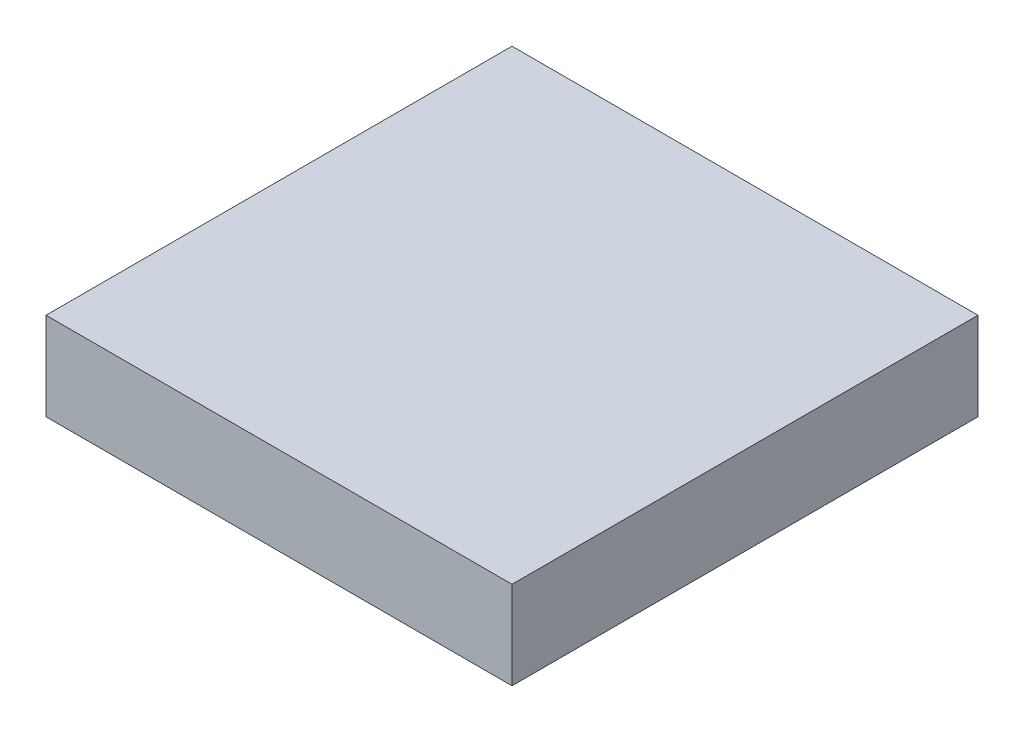
ISO-10303-21;
HEADER;
FILE_DESCRIPTION(('STEP AP214'),'2;1');
FILE_NAME('part.step','',(''),(''),'','','');
FILE_SCHEMA(('AUTOMOTIVE_DESIGN { 1 0 10303 214 1 1 1 1 }'));
ENDSEC;
DATA;
#1=APPLICATION_CONTEXT('core data for automotive mechanical design processes');
#2=APPLICATION_PROTOCOL_DEFINITION('international standard','automotive_design',2000,#1);
#3=PRODUCT_CONTEXT('',#1,'mechanical');
#4=PRODUCT('Part','Part','',(#3));
#5=PRODUCT_RELATED_PRODUCT_CATEGORY('part','',(#4));
#6=PRODUCT_DEFINITION_FORMATION('','',#4);
#7=PRODUCT_DEFINITION_CONTEXT('part definition',#1,'design');
#8=PRODUCT_DEFINITION('design','',#6,#7);
#9=PRODUCT_DEFINITION_SHAPE('','',#8);
#10=(LENGTH_UNIT() NAMED_UNIT(*) SI_UNIT(.MILLI.,.METRE.));
#11=(NAMED_UNIT(*) PLANE_ANGLE_UNIT() SI_UNIT($,.RADIAN.));
#12=(NAMED_UNIT(*) SI_UNIT($,.STERADIAN.) SOLID_ANGLE_UNIT());
#13=UNCERTAINTY_MEASURE_WITH_UNIT(LENGTH_MEASURE(1.E-05),#10,'distance_accuracy_value','');
#14=(GEOMETRIC_REPRESENTATION_CONTEXT(3) GLOBAL_UNCERTAINTY_ASSIGNED_CONTEXT((#13)) GLOBAL_UNIT_ASSIGNED_CONTEXT((#10,
#11,#12)) REPRESENTATION_CONTEXT('',''));
#15=CARTESIAN_POINT('',(0.,0.,0.));
#16=DIRECTION('',(0.,0.,1.));
#17=DIRECTION('',(1.,0.,0.));
#18=AXIS2_PLACEMENT_3D('',#15,#16,#17);
#19=CARTESIAN_POINT('',(-28.2073714285502,10.,-45.4060499287839));
#20=DIRECTION('',(1.,0.,0.));
#21=DIRECTION('',(0.,0.,-1.));
#22=AXIS2_PLACEMENT_3D('',#19,#20,#21);
#23=PLANE('',#22);
#24=DIRECTION('',(0.,0.,1.));
#25=VECTOR('',#24,1.);
#26=CARTESIAN_POINT('',(-28.2073714285502,0.,-45.4060499287839));
#27=LINE('',#26,#25);
#28=CARTESIAN_POINT('',(-28.2073714285502,0.,-45.4060499287839));
#29=VERTEX_POINT('',#28);
#30=CARTESIAN_POINT('',(-28.2073714285502,0.,7.59395007121611));
#31=VERTEX_POINT('',#30);
#32=EDGE_CURVE('E96',#29,#31,#27,.T.);
#33=ORIENTED_EDGE('',*,*,#32,.T.);
#34=DIRECTION('',(0.,-1.,0.));
#35=VECTOR('',#34,1.);
#36=CARTESIAN_POINT('',(-28.2073714285502,10.,7.59395007121611));
#37=LINE('',#36,#35);
#38=CARTESIAN_POINT('',(-28.2073714285502,10.,7.59395007121611));
#39=VERTEX_POINT('',#38);
#40=EDGE_CURVE('E11',#39,#31,#37,.T.);
#41=ORIENTED_EDGE('',*,*,#40,.F.);
#42=DIRECTION('',(0.,0.,1.));
#43=VECTOR('',#42,1.);
#44=CARTESIAN_POINT('',(-28.2073714285502,10.,-45.4060499287839));
#45=LINE('',#44,#43);
#46=CARTESIAN_POINT('',(-28.2073714285502,10.,-45.4060499287839));
#47=VERTEX_POINT('',#46);
#48=EDGE_CURVE('E84',#47,#39,#45,.T.);
#49=ORIENTED_EDGE('',*,*,#48,.F.);
#50=DIRECTION('',(0.,-1.,0.));
#51=VECTOR('',#50,1.);
#52=CARTESIAN_POINT('',(-28.2073714285502,10.,-45.4060499287839));
#53=LINE('',#52,#51);
#54=EDGE_CURVE('E92',#47,#29,#53,.T.);
#55=ORIENTED_EDGE('',*,*,#54,.T.);
#56=EDGE_LOOP('',(#33,#41,#49,#55));
#57=FACE_BOUND('',#56,.T.);
#58=ADVANCED_FACE('F33',(#57),#23,.F.);
#59=CARTESIAN_POINT('',(-28.2073714285502,10.,7.59395007121611));
#60=DIRECTION('',(0.,0.,-1.));
#61=DIRECTION('',(-1.,0.,0.));
#62=AXIS2_PLACEMENT_3D('',#59,#60,#61);
#63=PLANE('',#62);
#64=DIRECTION('',(1.,0.,0.));
#65=VECTOR('',#64,1.);
#66=CARTESIAN_POINT('',(-28.2073714285502,0.,7.59395007121611));
#67=LINE('',#66,#65);
#68=CARTESIAN_POINT('',(24.7926285714498,0.,7.59395007121611));
#69=VERTEX_POINT('',#68);
#70=EDGE_CURVE('E88',#31,#69,#67,.T.);
#71=ORIENTED_EDGE('',*,*,#70,.T.);
#72=DIRECTION('',(0.,-1.,0.));
#73=VECTOR('',#72,1.);
#74=CARTESIAN_POINT('',(24.7926285714498,10.,7.59395007121611));
#75=LINE('',#74,#73);
#76=CARTESIAN_POINT('',(24.7926285714498,10.,7.59395007121611));
#77=VERTEX_POINT('',#76);
#78=EDGE_CURVE('E41',#77,#69,#75,.T.);
#79=ORIENTED_EDGE('',*,*,#78,.F.);
#80=DIRECTION('',(1.,0.,0.));
#81=VECTOR('',#80,1.);
#82=CARTESIAN_POINT('',(-28.2073714285502,10.,7.59395007121611));
#83=LINE('',#82,#81);
#84=EDGE_CURVE('E79',#39,#77,#83,.T.);
#85=ORIENTED_EDGE('',*,*,#84,.F.);
#86=ORIENTED_EDGE('',*,*,#40,.T.);
#87=EDGE_LOOP('',(#71,#79,#85,#86));
#88=FACE_BOUND('',#87,.T.);
#89=ADVANCED_FACE('F87',(#88),#63,.F.);
#90=CARTESIAN_POINT('',(24.7926285714498,10.,-45.4060499287839));
#91=DIRECTION('',(-1.,0.,0.));
#92=DIRECTION('',(0.,0.,1.));
#93=AXIS2_PLACEMENT_3D('',#90,#91,#92);
#94=PLANE('',#93);
#95=DIRECTION('',(0.,0.,-1.));
#96=VECTOR('',#95,1.);
#97=CARTESIAN_POINT('',(24.7926285714498,0.,-45.4060499287839));
#98=LINE('',#97,#96);
#99=CARTESIAN_POINT('',(24.7926285714498,0.,-45.4060499287839));
#100=VERTEX_POINT('',#99);
#101=EDGE_CURVE('E66',#69,#100,#98,.T.);
#102=ORIENTED_EDGE('',*,*,#101,.T.);
#103=DIRECTION('',(0.,-1.,0.));
#104=VECTOR('',#103,1.);
#105=CARTESIAN_POINT('',(24.7926285714498,10.,-45.4060499287839));
#106=LINE('',#105,#104);
#107=CARTESIAN_POINT('',(24.7926285714498,10.,-45.4060499287839));
#108=VERTEX_POINT('',#107);
#109=EDGE_CURVE('E89',#108,#100,#106,.T.);
#110=ORIENTED_EDGE('',*,*,#109,.F.);
#111=DIRECTION('',(0.,0.,-1.));
#112=VECTOR('',#111,1.);
#113=CARTESIAN_POINT('',(24.7926285714498,10.,-45.4060499287839));
#114=LINE('',#113,#112);
#115=EDGE_CURVE('E82',#77,#108,#114,.T.);
#116=ORIENTED_EDGE('',*,*,#115,.F.);
#117=ORIENTED_EDGE('',*,*,#78,.T.);
#118=EDGE_LOOP('',(#102,#110,#116,#117));
#119=FACE_BOUND('',#118,.T.);
#120=ADVANCED_FACE('F90',(#119),#94,.F.);
#121=CARTESIAN_POINT('',(-28.2073714285502,10.,-45.4060499287839));
#122=DIRECTION('',(0.,0.,1.));
#123=DIRECTION('',(1.,0.,0.));
#124=AXIS2_PLACEMENT_3D('',#121,#122,#123);
#125=PLANE('',#124);
#126=DIRECTION('',(-1.,0.,0.));
#127=VECTOR('',#126,1.);
#128=CARTESIAN_POINT('',(-28.2073714285502,0.,-45.4060499287839));
#129=LINE('',#128,#127);
#130=EDGE_CURVE('E72',#100,#29,#129,.T.);
#131=ORIENTED_EDGE('',*,*,#130,.T.);
#132=ORIENTED_EDGE('',*,*,#54,.F.);
#133=DIRECTION('',(-1.,0.,0.));
#134=VECTOR('',#133,1.);
#135=CARTESIAN_POINT('',(-28.2073714285502,10.,-45.4060499287839));
#136=LINE('',#135,#134);
#137=EDGE_CURVE('E49',#108,#47,#136,.T.);
#138=ORIENTED_EDGE('',*,*,#137,.F.);
#139=ORIENTED_EDGE('',*,*,#109,.T.);
#140=EDGE_LOOP('',(#131,#132,#138,#139));
#141=FACE_BOUND('',#140,.T.);
#142=ADVANCED_FACE('F103',(#141),#125,.F.);
#143=CARTESIAN_POINT('',(0.,10.,0.));
#144=DIRECTION('',(0.,1.,0.));
#145=DIRECTION('',(0.,0.,1.));
#146=AXIS2_PLACEMENT_3D('',#143,#144,#145);
#147=PLANE('',#146);
#148=ORIENTED_EDGE('',*,*,#48,.T.);
#149=ORIENTED_EDGE('',*,*,#84,.T.);
#150=ORIENTED_EDGE('',*,*,#115,.T.);
#151=ORIENTED_EDGE('',*,*,#137,.T.);
#152=EDGE_LOOP('',(#148,#149,#150,#151));
#153=FACE_BOUND('',#152,.T.);
#154=ADVANCED_FACE('F80',(#153),#147,.T.);
#155=CARTESIAN_POINT('',(0.,0.,0.));
#156=DIRECTION('',(0.,1.,0.));
#157=DIRECTION('',(0.,0.,1.));
#158=AXIS2_PLACEMENT_3D('',#155,#156,#157);
#159=PLANE('',#158);
#160=ORIENTED_EDGE('',*,*,#32,.F.);
#161=ORIENTED_EDGE('',*,*,#130,.F.);
#162=ORIENTED_EDGE('',*,*,#101,.F.);
#163=ORIENTED_EDGE('',*,*,#70,.F.);
#164=EDGE_LOOP('',(#160,#161,#162,#163));
#165=FACE_BOUND('',#164,.T.);
#166=ADVANCED_FACE('F106',(#165),#159,.F.);
#167=CLOSED_SHELL('',(#58,#89,#120,#142,#154,#166));
#168=MANIFOLD_SOLID_BREP('B2',#167);
#169=ADVANCED_BREP_SHAPE_REPRESENTATION('',(#18,#168),#14);
#170=SHAPE_DEFINITION_REPRESENTATION(#9,#169);
ENDSEC;
END-ISO-10303-21;
